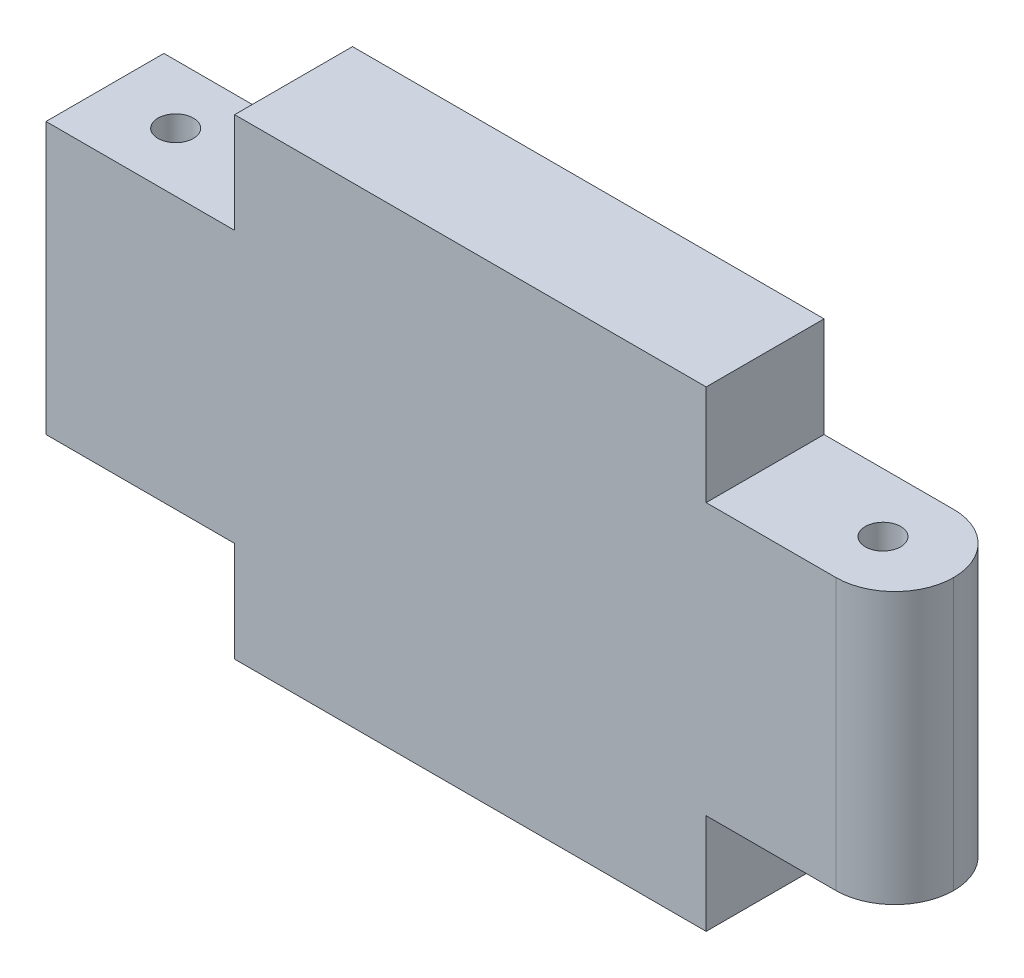
ISO-10303-21;
HEADER;
FILE_DESCRIPTION(('STEP AP214'),'2;1');
FILE_NAME('part.step','',(''),(''),'','','');
FILE_SCHEMA(('AUTOMOTIVE_DESIGN { 1 0 10303 214 1 1 1 1 }'));
ENDSEC;
DATA;
#1=APPLICATION_CONTEXT('core data for automotive mechanical design processes');
#2=APPLICATION_PROTOCOL_DEFINITION('international standard','automotive_design',2000,#1);
#3=PRODUCT_CONTEXT('',#1,'mechanical');
#4=PRODUCT('Part','Part','',(#3));
#5=PRODUCT_RELATED_PRODUCT_CATEGORY('part','',(#4));
#6=PRODUCT_DEFINITION_FORMATION('','',#4);
#7=PRODUCT_DEFINITION_CONTEXT('part definition',#1,'design');
#8=PRODUCT_DEFINITION('design','',#6,#7);
#9=PRODUCT_DEFINITION_SHAPE('','',#8);
#10=(LENGTH_UNIT() NAMED_UNIT(*) SI_UNIT(.MILLI.,.METRE.));
#11=(NAMED_UNIT(*) PLANE_ANGLE_UNIT() SI_UNIT($,.RADIAN.));
#12=(NAMED_UNIT(*) SI_UNIT($,.STERADIAN.) SOLID_ANGLE_UNIT());
#13=UNCERTAINTY_MEASURE_WITH_UNIT(LENGTH_MEASURE(1.E-05),#10,'distance_accuracy_value','');
#14=(GEOMETRIC_REPRESENTATION_CONTEXT(3) GLOBAL_UNCERTAINTY_ASSIGNED_CONTEXT((#13)) GLOBAL_UNIT_ASSIGNED_CONTEXT((#10,
#11,#12)) REPRESENTATION_CONTEXT('',''));
#15=CARTESIAN_POINT('',(0.,0.,0.));
#16=DIRECTION('',(0.,0.,1.));
#17=DIRECTION('',(1.,0.,0.));
#18=AXIS2_PLACEMENT_3D('',#15,#16,#17);
#19=CARTESIAN_POINT('',(20.,20.,10.));
#20=DIRECTION('',(-1.,0.,0.));
#21=DIRECTION('',(0.,-1.,0.));
#22=AXIS2_PLACEMENT_3D('',#19,#20,#21);
#23=PLANE('',#22);
#24=DIRECTION('',(0.,1.,0.));
#25=VECTOR('',#24,1.);
#26=CARTESIAN_POINT('',(20.,20.,0.));
#27=LINE('',#26,#25);
#28=CARTESIAN_POINT('',(20.,-20.,0.));
#29=VERTEX_POINT('',#28);
#30=CARTESIAN_POINT('',(20.,-11.5,0.));
#31=VERTEX_POINT('',#30);
#32=EDGE_CURVE('E176',#29,#31,#27,.T.);
#33=ORIENTED_EDGE('',*,*,#32,.T.);
#34=DIRECTION('',(0.,0.,1.));
#35=VECTOR('',#34,1.);
#36=CARTESIAN_POINT('',(20.,-11.5,0.));
#37=LINE('',#36,#35);
#38=CARTESIAN_POINT('',(20.,-11.5,10.));
#39=VERTEX_POINT('',#38);
#40=EDGE_CURVE('E150',#31,#39,#37,.T.);
#41=ORIENTED_EDGE('',*,*,#40,.T.);
#42=DIRECTION('',(0.,1.,0.));
#43=VECTOR('',#42,1.);
#44=CARTESIAN_POINT('',(20.,20.,10.));
#45=LINE('',#44,#43);
#46=CARTESIAN_POINT('',(20.,-20.,10.));
#47=VERTEX_POINT('',#46);
#48=EDGE_CURVE('E157',#47,#39,#45,.T.);
#49=ORIENTED_EDGE('',*,*,#48,.F.);
#50=DIRECTION('',(0.,0.,-1.));
#51=VECTOR('',#50,1.);
#52=CARTESIAN_POINT('',(20.,-20.,10.));
#53=LINE('',#52,#51);
#54=EDGE_CURVE('E175',#47,#29,#53,.T.);
#55=ORIENTED_EDGE('',*,*,#54,.T.);
#56=EDGE_LOOP('',(#33,#41,#49,#55));
#57=FACE_BOUND('',#56,.T.);
#58=ADVANCED_FACE('F37',(#57),#23,.F.);
#59=CARTESIAN_POINT('',(-20.,20.,10.));
#60=DIRECTION('',(1.,0.,0.));
#61=DIRECTION('',(0.,1.,0.));
#62=AXIS2_PLACEMENT_3D('',#59,#60,#61);
#63=PLANE('',#62);
#64=DIRECTION('',(0.,0.,-1.));
#65=VECTOR('',#64,1.);
#66=CARTESIAN_POINT('',(-20.,11.5,0.));
#67=LINE('',#66,#65);
#68=CARTESIAN_POINT('',(-20.,11.5,10.));
#69=VERTEX_POINT('',#68);
#70=CARTESIAN_POINT('',(-20.,11.5,0.));
#71=VERTEX_POINT('',#70);
#72=EDGE_CURVE('E233',#69,#71,#67,.T.);
#73=ORIENTED_EDGE('',*,*,#72,.F.);
#74=DIRECTION('',(0.,-1.,0.));
#75=VECTOR('',#74,1.);
#76=CARTESIAN_POINT('',(-20.,20.,10.));
#77=LINE('',#76,#75);
#78=CARTESIAN_POINT('',(-20.,20.,10.));
#79=VERTEX_POINT('',#78);
#80=EDGE_CURVE('E170',#79,#69,#77,.T.);
#81=ORIENTED_EDGE('',*,*,#80,.F.);
#82=DIRECTION('',(0.,0.,-1.));
#83=VECTOR('',#82,1.);
#84=CARTESIAN_POINT('',(-20.,20.,10.));
#85=LINE('',#84,#83);
#86=CARTESIAN_POINT('',(-20.,20.,0.));
#87=VERTEX_POINT('',#86);
#88=EDGE_CURVE('E189',#79,#87,#85,.T.);
#89=ORIENTED_EDGE('',*,*,#88,.T.);
#90=DIRECTION('',(0.,-1.,0.));
#91=VECTOR('',#90,1.);
#92=CARTESIAN_POINT('',(-20.,20.,0.));
#93=LINE('',#92,#91);
#94=EDGE_CURVE('E162',#87,#71,#93,.T.);
#95=ORIENTED_EDGE('',*,*,#94,.T.);
#96=EDGE_LOOP('',(#73,#81,#89,#95));
#97=FACE_BOUND('',#96,.T.);
#98=ADVANCED_FACE('F284',(#97),#63,.F.);
#99=DIRECTION('',(0.,0.,1.));
#100=VECTOR('',#99,1.);
#101=CARTESIAN_POINT('',(-20.,-11.5,0.));
#102=LINE('',#101,#100);
#103=CARTESIAN_POINT('',(-20.,-11.5,0.));
#104=VERTEX_POINT('',#103);
#105=CARTESIAN_POINT('',(-20.,-11.5,10.));
#106=VERTEX_POINT('',#105);
#107=EDGE_CURVE('E228',#104,#106,#102,.T.);
#108=ORIENTED_EDGE('',*,*,#107,.F.);
#109=CARTESIAN_POINT('',(-20.,-20.,0.));
#110=VERTEX_POINT('',#109);
#111=EDGE_CURVE('E182',#104,#110,#93,.T.);
#112=ORIENTED_EDGE('',*,*,#111,.T.);
#113=DIRECTION('',(0.,0.,-1.));
#114=VECTOR('',#113,1.);
#115=CARTESIAN_POINT('',(-20.,-20.,10.));
#116=LINE('',#115,#114);
#117=CARTESIAN_POINT('',(-20.,-20.,10.));
#118=VERTEX_POINT('',#117);
#119=EDGE_CURVE('E186',#118,#110,#116,.T.);
#120=ORIENTED_EDGE('',*,*,#119,.F.);
#121=EDGE_CURVE('E169',#106,#118,#77,.T.);
#122=ORIENTED_EDGE('',*,*,#121,.F.);
#123=EDGE_LOOP('',(#108,#112,#120,#122));
#124=FACE_BOUND('',#123,.T.);
#125=ADVANCED_FACE('F274',(#124),#63,.F.);
#126=CARTESIAN_POINT('',(20.,11.5,10.));
#127=VERTEX_POINT('',#126);
#128=CARTESIAN_POINT('',(20.,20.,10.));
#129=VERTEX_POINT('',#128);
#130=EDGE_CURVE('E137',#127,#129,#45,.T.);
#131=ORIENTED_EDGE('',*,*,#130,.F.);
#132=DIRECTION('',(0.,0.,-1.));
#133=VECTOR('',#132,1.);
#134=CARTESIAN_POINT('',(20.,11.5,0.));
#135=LINE('',#134,#133);
#136=CARTESIAN_POINT('',(20.,11.5,0.));
#137=VERTEX_POINT('',#136);
#138=EDGE_CURVE('E146',#127,#137,#135,.T.);
#139=ORIENTED_EDGE('',*,*,#138,.T.);
#140=CARTESIAN_POINT('',(20.,20.,0.));
#141=VERTEX_POINT('',#140);
#142=EDGE_CURVE('E180',#137,#141,#27,.T.);
#143=ORIENTED_EDGE('',*,*,#142,.T.);
#144=DIRECTION('',(0.,0.,-1.));
#145=VECTOR('',#144,1.);
#146=CARTESIAN_POINT('',(20.,20.,10.));
#147=LINE('',#146,#145);
#148=EDGE_CURVE('E156',#129,#141,#147,.T.);
#149=ORIENTED_EDGE('',*,*,#148,.F.);
#150=EDGE_LOOP('',(#131,#139,#143,#149));
#151=FACE_BOUND('',#150,.T.);
#152=ADVANCED_FACE('F154',(#151),#23,.F.);
#153=CARTESIAN_POINT('',(-20.,20.,10.));
#154=DIRECTION('',(0.,-1.,0.));
#155=DIRECTION('',(0.,0.,-1.));
#156=AXIS2_PLACEMENT_3D('',#153,#154,#155);
#157=PLANE('',#156);
#158=DIRECTION('',(-1.,0.,0.));
#159=VECTOR('',#158,1.);
#160=CARTESIAN_POINT('',(-20.,20.,0.));
#161=LINE('',#160,#159);
#162=EDGE_CURVE('E179',#141,#87,#161,.T.);
#163=ORIENTED_EDGE('',*,*,#162,.T.);
#164=ORIENTED_EDGE('',*,*,#88,.F.);
#165=DIRECTION('',(-1.,0.,0.));
#166=VECTOR('',#165,1.);
#167=CARTESIAN_POINT('',(-20.,20.,10.));
#168=LINE('',#167,#166);
#169=EDGE_CURVE('E161',#129,#79,#168,.T.);
#170=ORIENTED_EDGE('',*,*,#169,.F.);
#171=ORIENTED_EDGE('',*,*,#148,.T.);
#172=EDGE_LOOP('',(#163,#164,#170,#171));
#173=FACE_BOUND('',#172,.T.);
#174=ADVANCED_FACE('F260',(#173),#157,.F.);
#175=CARTESIAN_POINT('',(-20.,-20.,10.));
#176=DIRECTION('',(0.,1.,0.));
#177=DIRECTION('',(0.,0.,1.));
#178=AXIS2_PLACEMENT_3D('',#175,#176,#177);
#179=PLANE('',#178);
#180=DIRECTION('',(1.,0.,0.));
#181=VECTOR('',#180,1.);
#182=CARTESIAN_POINT('',(-20.,-20.,0.));
#183=LINE('',#182,#181);
#184=EDGE_CURVE('E158',#110,#29,#183,.T.);
#185=ORIENTED_EDGE('',*,*,#184,.T.);
#186=ORIENTED_EDGE('',*,*,#54,.F.);
#187=DIRECTION('',(1.,0.,0.));
#188=VECTOR('',#187,1.);
#189=CARTESIAN_POINT('',(-20.,-20.,10.));
#190=LINE('',#189,#188);
#191=EDGE_CURVE('E173',#118,#47,#190,.T.);
#192=ORIENTED_EDGE('',*,*,#191,.F.);
#193=ORIENTED_EDGE('',*,*,#119,.T.);
#194=EDGE_LOOP('',(#185,#186,#192,#193));
#195=FACE_BOUND('',#194,.T.);
#196=ADVANCED_FACE('F280',(#195),#179,.F.);
#197=CARTESIAN_POINT('',(0.,0.,10.));
#198=DIRECTION('',(0.,0.,1.));
#199=DIRECTION('',(1.,0.,0.));
#200=AXIS2_PLACEMENT_3D('',#197,#198,#199);
#201=PLANE('',#200);
#202=DIRECTION('',(-1.,0.,0.));
#203=VECTOR('',#202,1.);
#204=CARTESIAN_POINT('',(36.,-11.5,10.));
#205=LINE('',#204,#203);
#206=CARTESIAN_POINT('',(31.,-11.5,10.));
#207=VERTEX_POINT('',#206);
#208=EDGE_CURVE('E143',#207,#39,#205,.T.);
#209=ORIENTED_EDGE('',*,*,#208,.F.);
#210=DIRECTION('',(0.,1.,0.));
#211=VECTOR('',#210,1.);
#212=CARTESIAN_POINT('',(31.,0.,10.));
#213=LINE('',#212,#211);
#214=CARTESIAN_POINT('',(31.,11.5,10.));
#215=VERTEX_POINT('',#214);
#216=EDGE_CURVE('E140',#207,#215,#213,.T.);
#217=ORIENTED_EDGE('',*,*,#216,.T.);
#218=DIRECTION('',(-1.,0.,0.));
#219=VECTOR('',#218,1.);
#220=CARTESIAN_POINT('',(36.,11.5,10.));
#221=LINE('',#220,#219);
#222=EDGE_CURVE('E132',#215,#127,#221,.T.);
#223=ORIENTED_EDGE('',*,*,#222,.T.);
#224=ORIENTED_EDGE('',*,*,#130,.T.);
#225=ORIENTED_EDGE('',*,*,#169,.T.);
#226=ORIENTED_EDGE('',*,*,#80,.T.);
#227=DIRECTION('',(1.,0.,0.));
#228=VECTOR('',#227,1.);
#229=CARTESIAN_POINT('',(-36.,11.5,10.));
#230=LINE('',#229,#228);
#231=CARTESIAN_POINT('',(-36.,11.5,10.));
#232=VERTEX_POINT('',#231);
#233=EDGE_CURVE('E246',#232,#69,#230,.T.);
#234=ORIENTED_EDGE('',*,*,#233,.F.);
#235=DIRECTION('',(0.,1.,0.));
#236=VECTOR('',#235,1.);
#237=CARTESIAN_POINT('',(-36.,11.5,10.));
#238=LINE('',#237,#236);
#239=CARTESIAN_POINT('',(-36.,-11.5,10.));
#240=VERTEX_POINT('',#239);
#241=EDGE_CURVE('E235',#240,#232,#238,.T.);
#242=ORIENTED_EDGE('',*,*,#241,.F.);
#243=DIRECTION('',(1.,0.,0.));
#244=VECTOR('',#243,1.);
#245=CARTESIAN_POINT('',(-36.,-11.5,10.));
#246=LINE('',#245,#244);
#247=EDGE_CURVE('E248',#240,#106,#246,.T.);
#248=ORIENTED_EDGE('',*,*,#247,.T.);
#249=ORIENTED_EDGE('',*,*,#121,.T.);
#250=ORIENTED_EDGE('',*,*,#191,.T.);
#251=ORIENTED_EDGE('',*,*,#48,.T.);
#252=EDGE_LOOP('',(#209,#217,#223,#224,#225,#226,#234,#242,#248,#249,#250,#251));
#253=FACE_BOUND('',#252,.T.);
#254=ADVANCED_FACE('F135',(#253),#201,.T.);
#255=CARTESIAN_POINT('',(0.,0.,0.));
#256=DIRECTION('',(0.,0.,1.));
#257=DIRECTION('',(1.,0.,0.));
#258=AXIS2_PLACEMENT_3D('',#255,#256,#257);
#259=PLANE('',#258);
#260=DIRECTION('',(-1.,0.,0.));
#261=VECTOR('',#260,1.);
#262=CARTESIAN_POINT('',(36.,11.5,0.));
#263=LINE('',#262,#261);
#264=CARTESIAN_POINT('',(31.,11.5,0.));
#265=VERTEX_POINT('',#264);
#266=EDGE_CURVE('E142',#265,#137,#263,.T.);
#267=ORIENTED_EDGE('',*,*,#266,.F.);
#268=DIRECTION('',(0.,-1.,0.));
#269=VECTOR('',#268,1.);
#270=CARTESIAN_POINT('',(31.,-11.5,0.));
#271=LINE('',#270,#269);
#272=CARTESIAN_POINT('',(31.,-11.5,0.));
#273=VERTEX_POINT('',#272);
#274=EDGE_CURVE('E11',#265,#273,#271,.T.);
#275=ORIENTED_EDGE('',*,*,#274,.T.);
#276=DIRECTION('',(-1.,0.,0.));
#277=VECTOR('',#276,1.);
#278=CARTESIAN_POINT('',(36.,-11.5,0.));
#279=LINE('',#278,#277);
#280=EDGE_CURVE('E209',#273,#31,#279,.T.);
#281=ORIENTED_EDGE('',*,*,#280,.T.);
#282=ORIENTED_EDGE('',*,*,#32,.F.);
#283=ORIENTED_EDGE('',*,*,#184,.F.);
#284=ORIENTED_EDGE('',*,*,#111,.F.);
#285=DIRECTION('',(1.,0.,0.));
#286=VECTOR('',#285,1.);
#287=CARTESIAN_POINT('',(-36.,-11.5,0.));
#288=LINE('',#287,#286);
#289=CARTESIAN_POINT('',(-36.,-11.5,0.));
#290=VERTEX_POINT('',#289);
#291=EDGE_CURVE('E166',#290,#104,#288,.T.);
#292=ORIENTED_EDGE('',*,*,#291,.F.);
#293=DIRECTION('',(0.,-1.,0.));
#294=VECTOR('',#293,1.);
#295=CARTESIAN_POINT('',(-36.,11.5,0.));
#296=LINE('',#295,#294);
#297=CARTESIAN_POINT('',(-36.,11.5,0.));
#298=VERTEX_POINT('',#297);
#299=EDGE_CURVE('E229',#298,#290,#296,.T.);
#300=ORIENTED_EDGE('',*,*,#299,.F.);
#301=DIRECTION('',(1.,0.,0.));
#302=VECTOR('',#301,1.);
#303=CARTESIAN_POINT('',(-36.,11.5,0.));
#304=LINE('',#303,#302);
#305=EDGE_CURVE('E239',#298,#71,#304,.T.);
#306=ORIENTED_EDGE('',*,*,#305,.T.);
#307=ORIENTED_EDGE('',*,*,#94,.F.);
#308=ORIENTED_EDGE('',*,*,#162,.F.);
#309=ORIENTED_EDGE('',*,*,#142,.F.);
#310=EDGE_LOOP('',(#267,#275,#281,#282,#283,#284,#292,#300,#306,#307,#308,#309));
#311=FACE_BOUND('',#310,.T.);
#312=ADVANCED_FACE('F257',(#311),#259,.F.);
#313=CARTESIAN_POINT('',(-36.,-11.5,0.));
#314=DIRECTION('',(0.,1.,0.));
#315=DIRECTION('',(-1.,0.,0.));
#316=AXIS2_PLACEMENT_3D('',#313,#314,#315);
#317=PLANE('',#316);
#318=CARTESIAN_POINT('',(-30.,-11.5,5.));
#319=DIRECTION('',(0.,1.,0.));
#320=DIRECTION('',(-1.,0.,0.));
#321=AXIS2_PLACEMENT_3D('',#318,#319,#320);
#322=CIRCLE('',#321,1.5);
#323=CARTESIAN_POINT('',(-31.5,-11.5,5.));
#324=VERTEX_POINT('',#323);
#325=EDGE_CURVE('E225',#324,#324,#322,.T.);
#326=ORIENTED_EDGE('',*,*,#325,.T.);
#327=EDGE_LOOP('',(#326));
#328=FACE_BOUND('',#327,.T.);
#329=ORIENTED_EDGE('',*,*,#107,.T.);
#330=ORIENTED_EDGE('',*,*,#247,.F.);
#331=DIRECTION('',(0.,0.,1.));
#332=VECTOR('',#331,1.);
#333=CARTESIAN_POINT('',(-36.,-11.5,0.));
#334=LINE('',#333,#332);
#335=EDGE_CURVE('E232',#290,#240,#334,.T.);
#336=ORIENTED_EDGE('',*,*,#335,.F.);
#337=ORIENTED_EDGE('',*,*,#291,.T.);
#338=EDGE_LOOP('',(#329,#330,#336,#337));
#339=FACE_BOUND('',#338,.T.);
#340=ADVANCED_FACE('F271',(#328,#339),#317,.F.);
#341=CARTESIAN_POINT('',(-36.,11.5,0.));
#342=DIRECTION('',(0.,-1.,0.));
#343=DIRECTION('',(1.,0.,0.));
#344=AXIS2_PLACEMENT_3D('',#341,#342,#343);
#345=PLANE('',#344);
#346=CARTESIAN_POINT('',(-30.,11.5,5.));
#347=DIRECTION('',(0.,1.,0.));
#348=DIRECTION('',(-1.,0.,0.));
#349=AXIS2_PLACEMENT_3D('',#346,#347,#348);
#350=CIRCLE('',#349,1.5);
#351=CARTESIAN_POINT('',(-31.5,11.5,5.));
#352=VERTEX_POINT('',#351);
#353=EDGE_CURVE('E222',#352,#352,#350,.T.);
#354=ORIENTED_EDGE('',*,*,#353,.F.);
#355=EDGE_LOOP('',(#354));
#356=FACE_BOUND('',#355,.T.);
#357=ORIENTED_EDGE('',*,*,#72,.T.);
#358=ORIENTED_EDGE('',*,*,#305,.F.);
#359=DIRECTION('',(0.,0.,-1.));
#360=VECTOR('',#359,1.);
#361=CARTESIAN_POINT('',(-36.,11.5,0.));
#362=LINE('',#361,#360);
#363=EDGE_CURVE('E237',#232,#298,#362,.T.);
#364=ORIENTED_EDGE('',*,*,#363,.F.);
#365=ORIENTED_EDGE('',*,*,#233,.T.);
#366=EDGE_LOOP('',(#357,#358,#364,#365));
#367=FACE_BOUND('',#366,.T.);
#368=ADVANCED_FACE('F266',(#356,#367),#345,.F.);
#369=CARTESIAN_POINT('',(-36.,0.,0.));
#370=DIRECTION('',(-1.,0.,0.));
#371=DIRECTION('',(0.,-1.,0.));
#372=AXIS2_PLACEMENT_3D('',#369,#370,#371);
#373=PLANE('',#372);
#374=ORIENTED_EDGE('',*,*,#299,.T.);
#375=ORIENTED_EDGE('',*,*,#335,.T.);
#376=ORIENTED_EDGE('',*,*,#241,.T.);
#377=ORIENTED_EDGE('',*,*,#363,.T.);
#378=EDGE_LOOP('',(#374,#375,#376,#377));
#379=FACE_BOUND('',#378,.T.);
#380=ADVANCED_FACE('F270',(#379),#373,.T.);
#381=CARTESIAN_POINT('',(-30.,-18.5,5.));
#382=DIRECTION('',(0.,1.,0.));
#383=DIRECTION('',(-1.,0.,0.));
#384=AXIS2_PLACEMENT_3D('',#381,#382,#383);
#385=CYLINDRICAL_SURFACE('',#384,1.5);
#386=ORIENTED_EDGE('',*,*,#353,.T.);
#387=EDGE_LOOP('',(#386));
#388=FACE_BOUND('',#387,.T.);
#389=ORIENTED_EDGE('',*,*,#325,.F.);
#390=EDGE_LOOP('',(#389));
#391=FACE_BOUND('',#390,.T.);
#392=ADVANCED_FACE('F313',(#388,#391),#385,.F.);
#393=CARTESIAN_POINT('',(36.,11.5,0.));
#394=DIRECTION('',(0.,1.,0.));
#395=DIRECTION('',(-1.,0.,0.));
#396=AXIS2_PLACEMENT_3D('',#393,#394,#395);
#397=PLANE('',#396);
#398=CARTESIAN_POINT('',(30.,11.5,5.));
#399=DIRECTION('',(0.,-1.,0.));
#400=DIRECTION('',(1.,0.,0.));
#401=AXIS2_PLACEMENT_3D('',#398,#399,#400);
#402=CIRCLE('',#401,1.5);
#403=CARTESIAN_POINT('',(31.5,11.5,5.));
#404=VERTEX_POINT('',#403);
#405=EDGE_CURVE('E195',#404,#404,#402,.T.);
#406=ORIENTED_EDGE('',*,*,#405,.T.);
#407=EDGE_LOOP('',(#406));
#408=FACE_BOUND('',#407,.T.);
#409=ORIENTED_EDGE('',*,*,#222,.F.);
#410=CARTESIAN_POINT('',(31.,11.5,5.));
#411=DIRECTION('',(0.,1.,0.));
#412=DIRECTION('',(-1.,0.,0.));
#413=AXIS2_PLACEMENT_3D('',#410,#411,#412);
#414=CIRCLE('',#413,5.);
#415=CARTESIAN_POINT('',(36.,11.5,5.));
#416=VERTEX_POINT('',#415);
#417=EDGE_CURVE('E199',#215,#416,#414,.T.);
#418=ORIENTED_EDGE('',*,*,#417,.T.);
#419=CARTESIAN_POINT('',(31.,11.5,5.));
#420=DIRECTION('',(0.,1.,0.));
#421=DIRECTION('',(-1.,0.,0.));
#422=AXIS2_PLACEMENT_3D('',#419,#420,#421);
#423=CIRCLE('',#422,5.);
#424=EDGE_CURVE('E197',#416,#265,#423,.T.);
#425=ORIENTED_EDGE('',*,*,#424,.T.);
#426=ORIENTED_EDGE('',*,*,#266,.T.);
#427=ORIENTED_EDGE('',*,*,#138,.F.);
#428=EDGE_LOOP('',(#409,#418,#425,#426,#427));
#429=FACE_BOUND('',#428,.T.);
#430=ADVANCED_FACE('F147',(#408,#429),#397,.T.);
#431=CARTESIAN_POINT('',(36.,-11.5,0.));
#432=DIRECTION('',(0.,-1.,0.));
#433=DIRECTION('',(1.,0.,0.));
#434=AXIS2_PLACEMENT_3D('',#431,#432,#433);
#435=PLANE('',#434);
#436=CARTESIAN_POINT('',(30.,-11.5,5.));
#437=DIRECTION('',(0.,-1.,0.));
#438=DIRECTION('',(1.,0.,0.));
#439=AXIS2_PLACEMENT_3D('',#436,#437,#438);
#440=CIRCLE('',#439,1.5);
#441=CARTESIAN_POINT('',(31.5,-11.5,5.));
#442=VERTEX_POINT('',#441);
#443=EDGE_CURVE('E151',#442,#442,#440,.F.);
#444=ORIENTED_EDGE('',*,*,#443,.T.);
#445=EDGE_LOOP('',(#444));
#446=FACE_BOUND('',#445,.T.);
#447=CARTESIAN_POINT('',(31.,-11.5,5.));
#448=DIRECTION('',(0.,-1.,0.));
#449=DIRECTION('',(1.,0.,0.));
#450=AXIS2_PLACEMENT_3D('',#447,#448,#449);
#451=CIRCLE('',#450,5.);
#452=CARTESIAN_POINT('',(36.,-11.5,5.));
#453=VERTEX_POINT('',#452);
#454=EDGE_CURVE('E53',#273,#453,#451,.T.);
#455=ORIENTED_EDGE('',*,*,#454,.T.);
#456=CARTESIAN_POINT('',(31.,-11.5,5.));
#457=DIRECTION('',(0.,-1.,0.));
#458=DIRECTION('',(1.,0.,0.));
#459=AXIS2_PLACEMENT_3D('',#456,#457,#458);
#460=CIRCLE('',#459,5.);
#461=EDGE_CURVE('E46',#453,#207,#460,.T.);
#462=ORIENTED_EDGE('',*,*,#461,.T.);
#463=ORIENTED_EDGE('',*,*,#208,.T.);
#464=ORIENTED_EDGE('',*,*,#40,.F.);
#465=ORIENTED_EDGE('',*,*,#280,.F.);
#466=EDGE_LOOP('',(#455,#462,#463,#464,#465));
#467=FACE_BOUND('',#466,.T.);
#468=ADVANCED_FACE('F203',(#446,#467),#435,.T.);
#469=CARTESIAN_POINT('',(30.,-18.5,5.));
#470=DIRECTION('',(0.,1.,0.));
#471=DIRECTION('',(-1.,0.,0.));
#472=AXIS2_PLACEMENT_3D('',#469,#470,#471);
#473=CYLINDRICAL_SURFACE('',#472,1.5);
#474=ORIENTED_EDGE('',*,*,#443,.F.);
#475=EDGE_LOOP('',(#474));
#476=FACE_BOUND('',#475,.T.);
#477=ORIENTED_EDGE('',*,*,#405,.F.);
#478=EDGE_LOOP('',(#477));
#479=FACE_BOUND('',#478,.T.);
#480=ADVANCED_FACE('F321',(#476,#479),#473,.F.);
#481=CARTESIAN_POINT('',(31.,0.,5.));
#482=DIRECTION('',(0.,1.,0.));
#483=DIRECTION('',(-1.,0.,0.));
#484=AXIS2_PLACEMENT_3D('',#481,#482,#483);
#485=CYLINDRICAL_SURFACE('',#484,5.);
#486=DIRECTION('',(0.,-1.,0.));
#487=VECTOR('',#486,1.);
#488=CARTESIAN_POINT('',(36.,11.5,5.));
#489=LINE('',#488,#487);
#490=EDGE_CURVE('E41',#453,#416,#489,.F.);
#491=ORIENTED_EDGE('',*,*,#490,.F.);
#492=ORIENTED_EDGE('',*,*,#454,.F.);
#493=ORIENTED_EDGE('',*,*,#274,.F.);
#494=ORIENTED_EDGE('',*,*,#424,.F.);
#495=EDGE_LOOP('',(#491,#492,#493,#494));
#496=FACE_BOUND('',#495,.T.);
#497=ADVANCED_FACE('F39',(#496),#485,.T.);
#498=CARTESIAN_POINT('',(31.,0.,5.));
#499=DIRECTION('',(0.,1.,0.));
#500=DIRECTION('',(-1.,0.,0.));
#501=AXIS2_PLACEMENT_3D('',#498,#499,#500);
#502=CYLINDRICAL_SURFACE('',#501,5.);
#503=ORIENTED_EDGE('',*,*,#461,.F.);
#504=ORIENTED_EDGE('',*,*,#490,.T.);
#505=ORIENTED_EDGE('',*,*,#417,.F.);
#506=ORIENTED_EDGE('',*,*,#216,.F.);
#507=EDGE_LOOP('',(#503,#504,#505,#506));
#508=FACE_BOUND('',#507,.T.);
#509=ADVANCED_FACE('F211',(#508),#502,.T.);
#510=CLOSED_SHELL('',(#58,#98,#125,#152,#174,#196,#254,#312,#340,#368,#380,#392,#430,#468,#480,
#497,#509));
#511=MANIFOLD_SOLID_BREP('B2',#510);
#512=ADVANCED_BREP_SHAPE_REPRESENTATION('',(#18,#511),#14);
#513=SHAPE_DEFINITION_REPRESENTATION(#9,#512);
ENDSEC;
END-ISO-10303-21;
